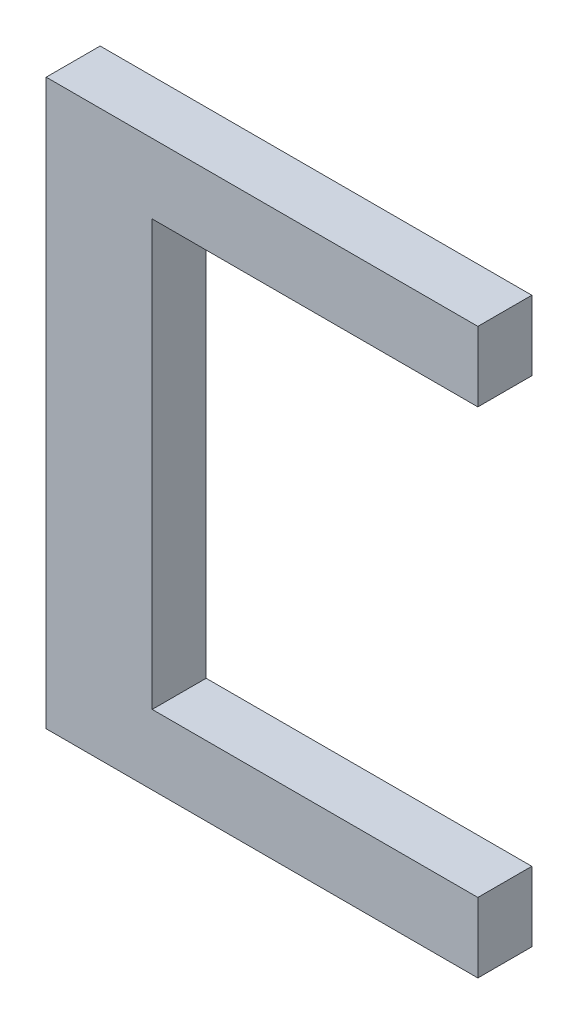
ISO-10303-21;
HEADER;
FILE_DESCRIPTION(('STEP AP214'),'2;1');
FILE_NAME('part.step','',(''),(''),'','','');
FILE_SCHEMA(('AUTOMOTIVE_DESIGN { 1 0 10303 214 1 1 1 1 }'));
ENDSEC;
DATA;
#1=APPLICATION_CONTEXT('core data for automotive mechanical design processes');
#2=APPLICATION_PROTOCOL_DEFINITION('international standard','automotive_design',2000,#1);
#3=PRODUCT_CONTEXT('',#1,'mechanical');
#4=PRODUCT('Part','Part','',(#3));
#5=PRODUCT_RELATED_PRODUCT_CATEGORY('part','',(#4));
#6=PRODUCT_DEFINITION_FORMATION('','',#4);
#7=PRODUCT_DEFINITION_CONTEXT('part definition',#1,'design');
#8=PRODUCT_DEFINITION('design','',#6,#7);
#9=PRODUCT_DEFINITION_SHAPE('','',#8);
#10=(LENGTH_UNIT() NAMED_UNIT(*) SI_UNIT(.MILLI.,.METRE.));
#11=(NAMED_UNIT(*) PLANE_ANGLE_UNIT() SI_UNIT($,.RADIAN.));
#12=(NAMED_UNIT(*) SI_UNIT($,.STERADIAN.) SOLID_ANGLE_UNIT());
#13=UNCERTAINTY_MEASURE_WITH_UNIT(LENGTH_MEASURE(1.E-05),#10,'distance_accuracy_value','');
#14=(GEOMETRIC_REPRESENTATION_CONTEXT(3) GLOBAL_UNCERTAINTY_ASSIGNED_CONTEXT((#13)) GLOBAL_UNIT_ASSIGNED_CONTEXT((#10,
#11,#12)) REPRESENTATION_CONTEXT('',''));
#15=CARTESIAN_POINT('',(0.,0.,0.));
#16=DIRECTION('',(0.,0.,1.));
#17=DIRECTION('',(1.,0.,0.));
#18=AXIS2_PLACEMENT_3D('',#15,#16,#17);
#19=CARTESIAN_POINT('',(5.89500000000015,3.88,3.));
#20=DIRECTION('',(-1.,0.,0.));
#21=DIRECTION('',(0.,-1.,0.));
#22=AXIS2_PLACEMENT_3D('',#19,#20,#21);
#23=PLANE('',#22);
#24=DIRECTION('',(0.,1.,0.));
#25=VECTOR('',#24,1.);
#26=CARTESIAN_POINT('',(5.89500000000015,3.88,0.));
#27=LINE('',#26,#25);
#28=CARTESIAN_POINT('',(5.89500000000015,3.88,0.));
#29=VERTEX_POINT('',#28);
#30=CARTESIAN_POINT('',(5.89500000000015,27.5019999999999,0.));
#31=VERTEX_POINT('',#30);
#32=EDGE_CURVE('E129',#29,#31,#27,.T.);
#33=ORIENTED_EDGE('',*,*,#32,.T.);
#34=DIRECTION('',(0.,0.,-1.));
#35=VECTOR('',#34,1.);
#36=CARTESIAN_POINT('',(5.89500000000015,27.5019999999999,3.));
#37=LINE('',#36,#35);
#38=CARTESIAN_POINT('',(5.89500000000015,27.5019999999999,3.));
#39=VERTEX_POINT('',#38);
#40=EDGE_CURVE('E11',#39,#31,#37,.T.);
#41=ORIENTED_EDGE('',*,*,#40,.F.);
#42=DIRECTION('',(0.,1.,0.));
#43=VECTOR('',#42,1.);
#44=CARTESIAN_POINT('',(5.89500000000015,3.88,3.));
#45=LINE('',#44,#43);
#46=CARTESIAN_POINT('',(5.89500000000015,3.88,3.));
#47=VERTEX_POINT('',#46);
#48=EDGE_CURVE('E143',#47,#39,#45,.T.);
#49=ORIENTED_EDGE('',*,*,#48,.F.);
#50=DIRECTION('',(0.,0.,-1.));
#51=VECTOR('',#50,1.);
#52=CARTESIAN_POINT('',(5.89500000000015,3.88,3.));
#53=LINE('',#52,#51);
#54=EDGE_CURVE('E125',#47,#29,#53,.T.);
#55=ORIENTED_EDGE('',*,*,#54,.T.);
#56=EDGE_LOOP('',(#33,#41,#49,#55));
#57=FACE_BOUND('',#56,.T.);
#58=ADVANCED_FACE('F33',(#57),#23,.F.);
#59=CARTESIAN_POINT('',(5.89500000000015,27.5019999999999,3.));
#60=DIRECTION('',(0.,1.,0.));
#61=DIRECTION('',(0.,0.,1.));
#62=AXIS2_PLACEMENT_3D('',#59,#60,#61);
#63=PLANE('',#62);
#64=DIRECTION('',(1.,0.,0.));
#65=VECTOR('',#64,1.);
#66=CARTESIAN_POINT('',(5.89500000000015,27.5019999999999,0.));
#67=LINE('',#66,#65);
#68=CARTESIAN_POINT('',(24.0041000000001,27.5019999999999,0.));
#69=VERTEX_POINT('',#68);
#70=EDGE_CURVE('E132',#31,#69,#67,.T.);
#71=ORIENTED_EDGE('',*,*,#70,.T.);
#72=DIRECTION('',(0.,0.,-1.));
#73=VECTOR('',#72,1.);
#74=CARTESIAN_POINT('',(24.0041000000001,27.5019999999999,3.));
#75=LINE('',#74,#73);
#76=CARTESIAN_POINT('',(24.0041000000001,27.5019999999999,3.));
#77=VERTEX_POINT('',#76);
#78=EDGE_CURVE('E41',#77,#69,#75,.T.);
#79=ORIENTED_EDGE('',*,*,#78,.F.);
#80=DIRECTION('',(1.,0.,0.));
#81=VECTOR('',#80,1.);
#82=CARTESIAN_POINT('',(5.89500000000015,27.5019999999999,3.));
#83=LINE('',#82,#81);
#84=EDGE_CURVE('E92',#39,#77,#83,.T.);
#85=ORIENTED_EDGE('',*,*,#84,.F.);
#86=ORIENTED_EDGE('',*,*,#40,.T.);
#87=EDGE_LOOP('',(#71,#79,#85,#86));
#88=FACE_BOUND('',#87,.T.);
#89=ADVANCED_FACE('F178',(#88),#63,.F.);
#90=CARTESIAN_POINT('',(24.0041000000001,27.5019999999999,3.));
#91=DIRECTION('',(-1.,0.,0.));
#92=DIRECTION('',(0.,0.,1.));
#93=AXIS2_PLACEMENT_3D('',#90,#91,#92);
#94=PLANE('',#93);
#95=DIRECTION('',(0.,1.,0.));
#96=VECTOR('',#95,1.);
#97=CARTESIAN_POINT('',(24.0041000000001,27.5019999999999,0.));
#98=LINE('',#97,#96);
#99=CARTESIAN_POINT('',(24.0041000000001,31.3819999999999,0.));
#100=VERTEX_POINT('',#99);
#101=EDGE_CURVE('E134',#69,#100,#98,.T.);
#102=ORIENTED_EDGE('',*,*,#101,.T.);
#103=DIRECTION('',(0.,0.,-1.));
#104=VECTOR('',#103,1.);
#105=CARTESIAN_POINT('',(24.0041000000001,31.3819999999999,3.));
#106=LINE('',#105,#104);
#107=CARTESIAN_POINT('',(24.0041000000001,31.3819999999999,3.));
#108=VERTEX_POINT('',#107);
#109=EDGE_CURVE('E150',#108,#100,#106,.T.);
#110=ORIENTED_EDGE('',*,*,#109,.F.);
#111=DIRECTION('',(0.,1.,0.));
#112=VECTOR('',#111,1.);
#113=CARTESIAN_POINT('',(24.0041000000001,27.5019999999999,3.));
#114=LINE('',#113,#112);
#115=EDGE_CURVE('E158',#77,#108,#114,.T.);
#116=ORIENTED_EDGE('',*,*,#115,.F.);
#117=ORIENTED_EDGE('',*,*,#78,.T.);
#118=EDGE_LOOP('',(#102,#110,#116,#117));
#119=FACE_BOUND('',#118,.T.);
#120=ADVANCED_FACE('F156',(#119),#94,.F.);
#121=CARTESIAN_POINT('',(24.0041000000001,31.3819999999999,3.));
#122=DIRECTION('',(0.,-1.,0.));
#123=DIRECTION('',(0.,0.,-1.));
#124=AXIS2_PLACEMENT_3D('',#121,#122,#123);
#125=PLANE('',#124);
#126=DIRECTION('',(-1.,0.,0.));
#127=VECTOR('',#126,1.);
#128=CARTESIAN_POINT('',(24.0041000000001,31.3819999999999,0.));
#129=LINE('',#128,#127);
#130=CARTESIAN_POINT('',(0.,31.3819999999999,0.));
#131=VERTEX_POINT('',#130);
#132=EDGE_CURVE('E136',#100,#131,#129,.T.);
#133=ORIENTED_EDGE('',*,*,#132,.T.);
#134=DIRECTION('',(0.,0.,-1.));
#135=VECTOR('',#134,1.);
#136=CARTESIAN_POINT('',(0.,31.3819999999999,3.));
#137=LINE('',#136,#135);
#138=CARTESIAN_POINT('',(0.,31.3819999999999,3.));
#139=VERTEX_POINT('',#138);
#140=EDGE_CURVE('E147',#139,#131,#137,.T.);
#141=ORIENTED_EDGE('',*,*,#140,.F.);
#142=DIRECTION('',(-1.,0.,0.));
#143=VECTOR('',#142,1.);
#144=CARTESIAN_POINT('',(24.0041000000001,31.3819999999999,3.));
#145=LINE('',#144,#143);
#146=EDGE_CURVE('E170',#108,#139,#145,.T.);
#147=ORIENTED_EDGE('',*,*,#146,.F.);
#148=ORIENTED_EDGE('',*,*,#109,.T.);
#149=EDGE_LOOP('',(#133,#141,#147,#148));
#150=FACE_BOUND('',#149,.T.);
#151=ADVANCED_FACE('F166',(#150),#125,.F.);
#152=CARTESIAN_POINT('',(0.,31.3819999999999,3.));
#153=DIRECTION('',(1.,0.,0.));
#154=DIRECTION('',(0.,1.,0.));
#155=AXIS2_PLACEMENT_3D('',#152,#153,#154);
#156=PLANE('',#155);
#157=DIRECTION('',(0.,-1.,0.));
#158=VECTOR('',#157,1.);
#159=CARTESIAN_POINT('',(0.,31.3819999999999,0.));
#160=LINE('',#159,#158);
#161=CARTESIAN_POINT('',(0.,0.,0.));
#162=VERTEX_POINT('',#161);
#163=EDGE_CURVE('E138',#131,#162,#160,.T.);
#164=ORIENTED_EDGE('',*,*,#163,.T.);
#165=DIRECTION('',(0.,0.,-1.));
#166=VECTOR('',#165,1.);
#167=CARTESIAN_POINT('',(0.,0.,3.));
#168=LINE('',#167,#166);
#169=CARTESIAN_POINT('',(0.,0.,3.));
#170=VERTEX_POINT('',#169);
#171=EDGE_CURVE('E120',#170,#162,#168,.T.);
#172=ORIENTED_EDGE('',*,*,#171,.F.);
#173=DIRECTION('',(0.,-1.,0.));
#174=VECTOR('',#173,1.);
#175=CARTESIAN_POINT('',(0.,31.3819999999999,3.));
#176=LINE('',#175,#174);
#177=EDGE_CURVE('E111',#139,#170,#176,.T.);
#178=ORIENTED_EDGE('',*,*,#177,.F.);
#179=ORIENTED_EDGE('',*,*,#140,.T.);
#180=EDGE_LOOP('',(#164,#172,#178,#179));
#181=FACE_BOUND('',#180,.T.);
#182=ADVANCED_FACE('F169',(#181),#156,.F.);
#183=CARTESIAN_POINT('',(0.,0.,3.));
#184=DIRECTION('',(0.,1.,0.));
#185=DIRECTION('',(0.,0.,1.));
#186=AXIS2_PLACEMENT_3D('',#183,#184,#185);
#187=PLANE('',#186);
#188=DIRECTION('',(1.,0.,0.));
#189=VECTOR('',#188,1.);
#190=CARTESIAN_POINT('',(0.,0.,0.));
#191=LINE('',#190,#189);
#192=CARTESIAN_POINT('',(24.0041000000001,0.,0.));
#193=VERTEX_POINT('',#192);
#194=EDGE_CURVE('E119',#162,#193,#191,.T.);
#195=ORIENTED_EDGE('',*,*,#194,.T.);
#196=DIRECTION('',(0.,0.,-1.));
#197=VECTOR('',#196,1.);
#198=CARTESIAN_POINT('',(24.0041000000001,0.,3.));
#199=LINE('',#198,#197);
#200=CARTESIAN_POINT('',(24.0041000000001,0.,3.));
#201=VERTEX_POINT('',#200);
#202=EDGE_CURVE('E116',#201,#193,#199,.T.);
#203=ORIENTED_EDGE('',*,*,#202,.F.);
#204=DIRECTION('',(1.,0.,0.));
#205=VECTOR('',#204,1.);
#206=CARTESIAN_POINT('',(0.,0.,3.));
#207=LINE('',#206,#205);
#208=EDGE_CURVE('E105',#170,#201,#207,.T.);
#209=ORIENTED_EDGE('',*,*,#208,.F.);
#210=ORIENTED_EDGE('',*,*,#171,.T.);
#211=EDGE_LOOP('',(#195,#203,#209,#210));
#212=FACE_BOUND('',#211,.T.);
#213=ADVANCED_FACE('F117',(#212),#187,.F.);
#214=CARTESIAN_POINT('',(24.0041000000001,0.,3.));
#215=DIRECTION('',(-1.,0.,0.));
#216=DIRECTION('',(0.,-1.,0.));
#217=AXIS2_PLACEMENT_3D('',#214,#215,#216);
#218=PLANE('',#217);
#219=DIRECTION('',(0.,1.,0.));
#220=VECTOR('',#219,1.);
#221=CARTESIAN_POINT('',(24.0041000000001,0.,0.));
#222=LINE('',#221,#220);
#223=CARTESIAN_POINT('',(24.0041000000001,3.88,0.));
#224=VERTEX_POINT('',#223);
#225=EDGE_CURVE('E78',#193,#224,#222,.T.);
#226=ORIENTED_EDGE('',*,*,#225,.T.);
#227=DIRECTION('',(0.,0.,-1.));
#228=VECTOR('',#227,1.);
#229=CARTESIAN_POINT('',(24.0041000000001,3.88,3.));
#230=LINE('',#229,#228);
#231=CARTESIAN_POINT('',(24.0041000000001,3.88,3.));
#232=VERTEX_POINT('',#231);
#233=EDGE_CURVE('E121',#232,#224,#230,.T.);
#234=ORIENTED_EDGE('',*,*,#233,.F.);
#235=DIRECTION('',(0.,1.,0.));
#236=VECTOR('',#235,1.);
#237=CARTESIAN_POINT('',(24.0041000000001,0.,3.));
#238=LINE('',#237,#236);
#239=EDGE_CURVE('E109',#201,#232,#238,.T.);
#240=ORIENTED_EDGE('',*,*,#239,.F.);
#241=ORIENTED_EDGE('',*,*,#202,.T.);
#242=EDGE_LOOP('',(#226,#234,#240,#241));
#243=FACE_BOUND('',#242,.T.);
#244=ADVANCED_FACE('F123',(#243),#218,.F.);
#245=CARTESIAN_POINT('',(24.0041000000001,3.88,3.));
#246=DIRECTION('',(0.,-1.,0.));
#247=DIRECTION('',(1.,0.,0.));
#248=AXIS2_PLACEMENT_3D('',#245,#246,#247);
#249=PLANE('',#248);
#250=DIRECTION('',(-1.,0.,0.));
#251=VECTOR('',#250,1.);
#252=CARTESIAN_POINT('',(24.0041000000001,3.88,0.));
#253=LINE('',#252,#251);
#254=EDGE_CURVE('E84',#224,#29,#253,.T.);
#255=ORIENTED_EDGE('',*,*,#254,.T.);
#256=ORIENTED_EDGE('',*,*,#54,.F.);
#257=DIRECTION('',(-1.,0.,0.));
#258=VECTOR('',#257,1.);
#259=CARTESIAN_POINT('',(24.0041000000001,3.88,3.));
#260=LINE('',#259,#258);
#261=EDGE_CURVE('E49',#232,#47,#260,.T.);
#262=ORIENTED_EDGE('',*,*,#261,.F.);
#263=ORIENTED_EDGE('',*,*,#233,.T.);
#264=EDGE_LOOP('',(#255,#256,#262,#263));
#265=FACE_BOUND('',#264,.T.);
#266=ADVANCED_FACE('F194',(#265),#249,.F.);
#267=CARTESIAN_POINT('',(0.,0.,3.));
#268=DIRECTION('',(0.,0.,-1.));
#269=DIRECTION('',(-1.,0.,0.));
#270=AXIS2_PLACEMENT_3D('',#267,#268,#269);
#271=PLANE('',#270);
#272=ORIENTED_EDGE('',*,*,#48,.T.);
#273=ORIENTED_EDGE('',*,*,#84,.T.);
#274=ORIENTED_EDGE('',*,*,#115,.T.);
#275=ORIENTED_EDGE('',*,*,#146,.T.);
#276=ORIENTED_EDGE('',*,*,#177,.T.);
#277=ORIENTED_EDGE('',*,*,#208,.T.);
#278=ORIENTED_EDGE('',*,*,#239,.T.);
#279=ORIENTED_EDGE('',*,*,#261,.T.);
#280=EDGE_LOOP('',(#272,#273,#274,#275,#276,#277,#278,#279));
#281=FACE_BOUND('',#280,.T.);
#282=ADVANCED_FACE('F107',(#281),#271,.F.);
#283=CARTESIAN_POINT('',(0.,0.,0.));
#284=DIRECTION('',(0.,0.,-1.));
#285=DIRECTION('',(-1.,0.,0.));
#286=AXIS2_PLACEMENT_3D('',#283,#284,#285);
#287=PLANE('',#286);
#288=ORIENTED_EDGE('',*,*,#32,.F.);
#289=ORIENTED_EDGE('',*,*,#254,.F.);
#290=ORIENTED_EDGE('',*,*,#225,.F.);
#291=ORIENTED_EDGE('',*,*,#194,.F.);
#292=ORIENTED_EDGE('',*,*,#163,.F.);
#293=ORIENTED_EDGE('',*,*,#132,.F.);
#294=ORIENTED_EDGE('',*,*,#101,.F.);
#295=ORIENTED_EDGE('',*,*,#70,.F.);
#296=EDGE_LOOP('',(#288,#289,#290,#291,#292,#293,#294,#295));
#297=FACE_BOUND('',#296,.T.);
#298=ADVANCED_FACE('F162',(#297),#287,.T.);
#299=CLOSED_SHELL('',(#58,#89,#120,#151,#182,#213,#244,#266,#282,#298));
#300=MANIFOLD_SOLID_BREP('B2',#299);
#301=ADVANCED_BREP_SHAPE_REPRESENTATION('',(#18,#300),#14);
#302=SHAPE_DEFINITION_REPRESENTATION(#9,#301);
ENDSEC;
END-ISO-10303-21;
